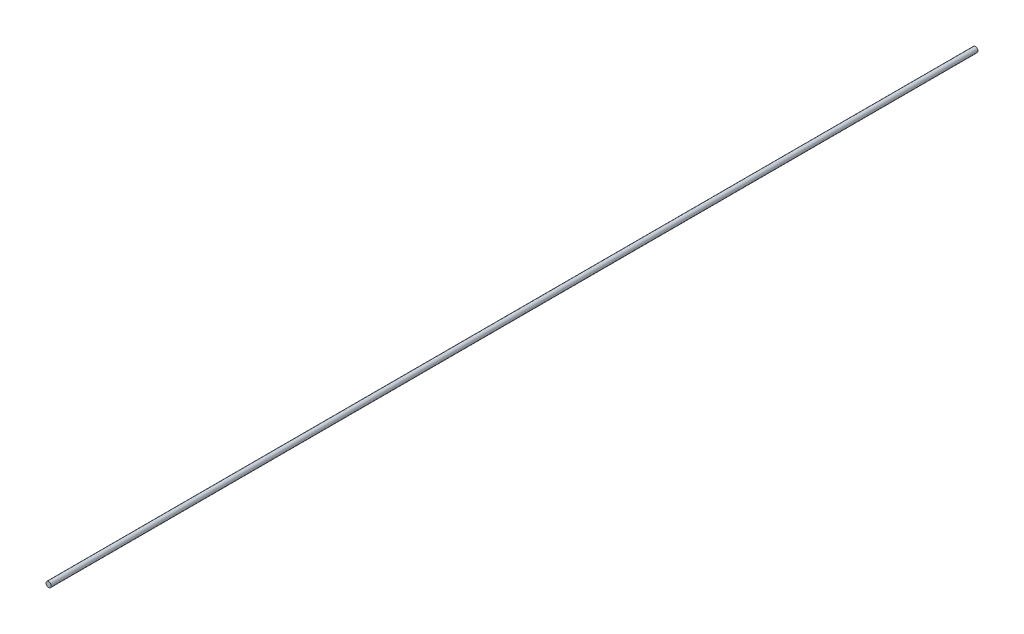
ISO-10303-21;
HEADER;
FILE_DESCRIPTION(('STEP AP214'),'2;1');
FILE_NAME('part.step','',(''),(''),'','','');
FILE_SCHEMA(('AUTOMOTIVE_DESIGN { 1 0 10303 214 1 1 1 1 }'));
ENDSEC;
DATA;
#1=APPLICATION_CONTEXT('core data for automotive mechanical design processes');
#2=APPLICATION_PROTOCOL_DEFINITION('international standard','automotive_design',2000,#1);
#3=PRODUCT_CONTEXT('',#1,'mechanical');
#4=PRODUCT('Part','Part','',(#3));
#5=PRODUCT_RELATED_PRODUCT_CATEGORY('part','',(#4));
#6=PRODUCT_DEFINITION_FORMATION('','',#4);
#7=PRODUCT_DEFINITION_CONTEXT('part definition',#1,'design');
#8=PRODUCT_DEFINITION('design','',#6,#7);
#9=PRODUCT_DEFINITION_SHAPE('','',#8);
#10=(LENGTH_UNIT() NAMED_UNIT(*) SI_UNIT(.MILLI.,.METRE.));
#11=(NAMED_UNIT(*) PLANE_ANGLE_UNIT() SI_UNIT($,.RADIAN.));
#12=(NAMED_UNIT(*) SI_UNIT($,.STERADIAN.) SOLID_ANGLE_UNIT());
#13=UNCERTAINTY_MEASURE_WITH_UNIT(LENGTH_MEASURE(1.E-05),#10,'distance_accuracy_value','');
#14=(GEOMETRIC_REPRESENTATION_CONTEXT(3) GLOBAL_UNCERTAINTY_ASSIGNED_CONTEXT((#13)) GLOBAL_UNIT_ASSIGNED_CONTEXT((#10,
#11,#12)) REPRESENTATION_CONTEXT('',''));
#15=CARTESIAN_POINT('',(0.,0.,0.));
#16=DIRECTION('',(0.,0.,1.));
#17=DIRECTION('',(1.,0.,0.));
#18=AXIS2_PLACEMENT_3D('',#15,#16,#17);
#19=CARTESIAN_POINT('',(0.,0.,4488.5504844));
#20=DIRECTION('',(0.,0.,-1.));
#21=DIRECTION('',(-1.,0.,0.));
#22=AXIS2_PLACEMENT_3D('',#19,#20,#21);
#23=CYLINDRICAL_SURFACE('',#22,12.7);
#24=CARTESIAN_POINT('',(0.,0.,4488.5504844));
#25=DIRECTION('',(0.,0.,1.));
#26=DIRECTION('',(1.,0.,0.));
#27=AXIS2_PLACEMENT_3D('',#24,#25,#26);
#28=CIRCLE('',#27,12.7);
#29=CARTESIAN_POINT('',(12.7,0.,4488.5504844));
#30=VERTEX_POINT('',#29);
#31=EDGE_CURVE('E10',#30,#30,#28,.T.);
#32=ORIENTED_EDGE('',*,*,#31,.F.);
#33=EDGE_LOOP('',(#32));
#34=FACE_BOUND('',#33,.T.);
#35=CARTESIAN_POINT('',(0.,0.,0.));
#36=DIRECTION('',(0.,0.,1.));
#37=DIRECTION('',(1.,0.,0.));
#38=AXIS2_PLACEMENT_3D('',#35,#36,#37);
#39=CIRCLE('',#38,12.7);
#40=CARTESIAN_POINT('',(12.7,0.,0.));
#41=VERTEX_POINT('',#40);
#42=EDGE_CURVE('E47',#41,#41,#39,.T.);
#43=ORIENTED_EDGE('',*,*,#42,.T.);
#44=EDGE_LOOP('',(#43));
#45=FACE_BOUND('',#44,.T.);
#46=ADVANCED_FACE('F44',(#34,#45),#23,.T.);
#47=CARTESIAN_POINT('',(0.,0.,4488.5504844));
#48=DIRECTION('',(0.,0.,1.));
#49=DIRECTION('',(1.,0.,0.));
#50=AXIS2_PLACEMENT_3D('',#47,#48,#49);
#51=PLANE('',#50);
#52=ORIENTED_EDGE('',*,*,#31,.T.);
#53=EDGE_LOOP('',(#52));
#54=FACE_BOUND('',#53,.T.);
#55=ADVANCED_FACE('F61',(#54),#51,.T.);
#56=CARTESIAN_POINT('',(0.,0.,0.));
#57=DIRECTION('',(0.,0.,1.));
#58=DIRECTION('',(1.,0.,0.));
#59=AXIS2_PLACEMENT_3D('',#56,#57,#58);
#60=PLANE('',#59);
#61=ORIENTED_EDGE('',*,*,#42,.F.);
#62=EDGE_LOOP('',(#61));
#63=FACE_BOUND('',#62,.T.);
#64=ADVANCED_FACE('F59',(#63),#60,.F.);
#65=CLOSED_SHELL('',(#46,#55,#64));
#66=MANIFOLD_SOLID_BREP('B2',#65);
#67=ADVANCED_BREP_SHAPE_REPRESENTATION('',(#18,#66),#14);
#68=SHAPE_DEFINITION_REPRESENTATION(#9,#67);
ENDSEC;
END-ISO-10303-21;
